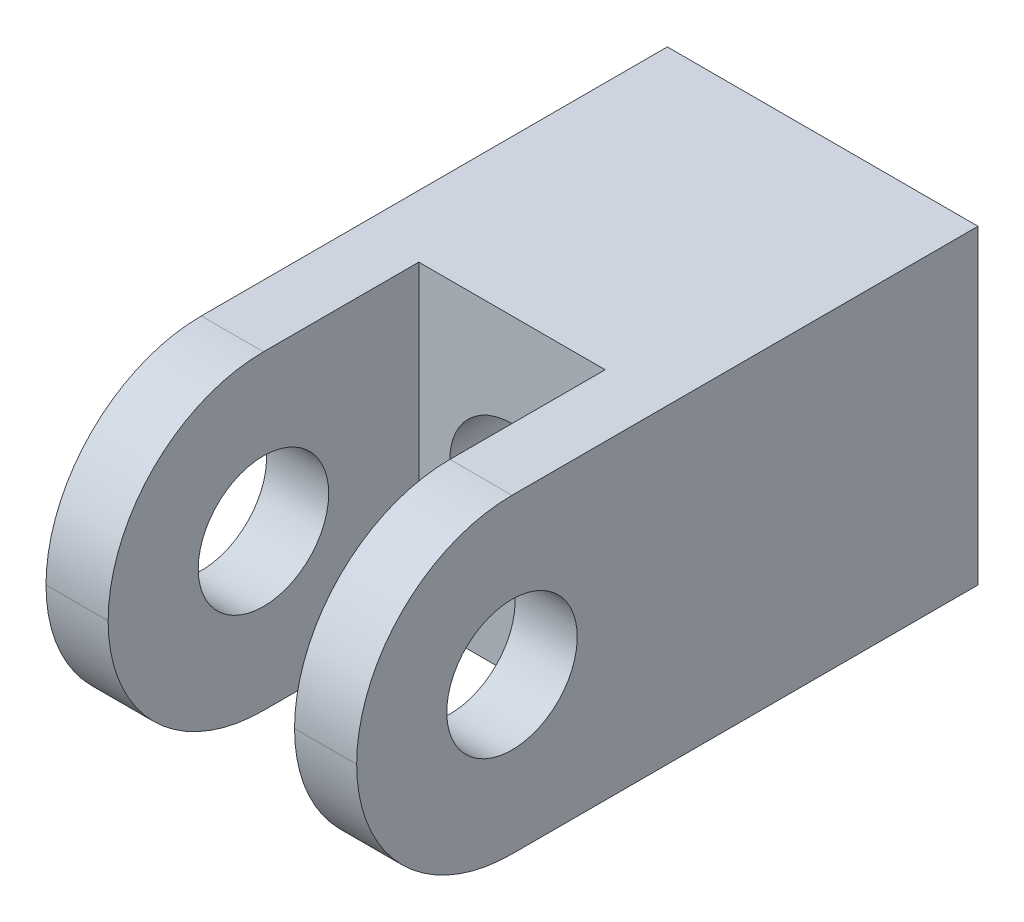
ISO-10303-21;
HEADER;
FILE_DESCRIPTION(('STEP AP214'),'2;1');
FILE_NAME('part.step','',(''),(''),'','','');
FILE_SCHEMA(('AUTOMOTIVE_DESIGN { 1 0 10303 214 1 1 1 1 }'));
ENDSEC;
DATA;
#1=APPLICATION_CONTEXT('core data for automotive mechanical design processes');
#2=APPLICATION_PROTOCOL_DEFINITION('international standard','automotive_design',2000,#1);
#3=PRODUCT_CONTEXT('',#1,'mechanical');
#4=PRODUCT('Part','Part','',(#3));
#5=PRODUCT_RELATED_PRODUCT_CATEGORY('part','',(#4));
#6=PRODUCT_DEFINITION_FORMATION('','',#4);
#7=PRODUCT_DEFINITION_CONTEXT('part definition',#1,'design');
#8=PRODUCT_DEFINITION('design','',#6,#7);
#9=PRODUCT_DEFINITION_SHAPE('','',#8);
#10=(LENGTH_UNIT() NAMED_UNIT(*) SI_UNIT(.MILLI.,.METRE.));
#11=(NAMED_UNIT(*) PLANE_ANGLE_UNIT() SI_UNIT($,.RADIAN.));
#12=(NAMED_UNIT(*) SI_UNIT($,.STERADIAN.) SOLID_ANGLE_UNIT());
#13=UNCERTAINTY_MEASURE_WITH_UNIT(LENGTH_MEASURE(1.E-05),#10,'distance_accuracy_value','');
#14=(GEOMETRIC_REPRESENTATION_CONTEXT(3) GLOBAL_UNCERTAINTY_ASSIGNED_CONTEXT((#13)) GLOBAL_UNIT_ASSIGNED_CONTEXT((#10,
#11,#12)) REPRESENTATION_CONTEXT('',''));
#15=CARTESIAN_POINT('',(0.,0.,0.));
#16=DIRECTION('',(0.,0.,1.));
#17=DIRECTION('',(1.,0.,0.));
#18=AXIS2_PLACEMENT_3D('',#15,#16,#17);
#19=CARTESIAN_POINT('',(0.,0.,10.));
#20=DIRECTION('',(0.,0.,-1.));
#21=DIRECTION('',(-1.,0.,0.));
#22=AXIS2_PLACEMENT_3D('',#19,#20,#21);
#23=PLANE('',#22);
#24=CARTESIAN_POINT('',(0.,0.,10.));
#25=DIRECTION('',(0.,0.,1.));
#26=DIRECTION('',(1.,0.,0.));
#27=AXIS2_PLACEMENT_3D('',#24,#25,#26);
#28=CIRCLE('',#27,2.);
#29=CARTESIAN_POINT('',(2.,0.,10.));
#30=VERTEX_POINT('',#29);
#31=EDGE_CURVE('E145',#30,#30,#28,.T.);
#32=ORIENTED_EDGE('',*,*,#31,.F.);
#33=EDGE_LOOP('',(#32));
#34=FACE_BOUND('',#33,.T.);
#35=DIRECTION('',(0.,-1.,0.));
#36=VECTOR('',#35,1.);
#37=CARTESIAN_POINT('',(3.,5.,10.));
#38=LINE('',#37,#36);
#39=CARTESIAN_POINT('',(3.,5.,10.));
#40=VERTEX_POINT('',#39);
#41=CARTESIAN_POINT('',(3.,-5.,10.));
#42=VERTEX_POINT('',#41);
#43=EDGE_CURVE('E131',#40,#42,#38,.T.);
#44=ORIENTED_EDGE('',*,*,#43,.F.);
#45=DIRECTION('',(-1.,0.,0.));
#46=VECTOR('',#45,1.);
#47=CARTESIAN_POINT('',(-5.,5.,10.));
#48=LINE('',#47,#46);
#49=CARTESIAN_POINT('',(-3.,5.,10.));
#50=VERTEX_POINT('',#49);
#51=EDGE_CURVE('E117',#40,#50,#48,.T.);
#52=ORIENTED_EDGE('',*,*,#51,.T.);
#53=DIRECTION('',(0.,1.,0.));
#54=VECTOR('',#53,1.);
#55=CARTESIAN_POINT('',(-3.,5.,10.));
#56=LINE('',#55,#54);
#57=CARTESIAN_POINT('',(-3.,-5.,10.));
#58=VERTEX_POINT('',#57);
#59=EDGE_CURVE('E123',#58,#50,#56,.T.);
#60=ORIENTED_EDGE('',*,*,#59,.F.);
#61=DIRECTION('',(1.,0.,0.));
#62=VECTOR('',#61,1.);
#63=CARTESIAN_POINT('',(-5.,-5.,10.));
#64=LINE('',#63,#62);
#65=EDGE_CURVE('E132',#58,#42,#64,.T.);
#66=ORIENTED_EDGE('',*,*,#65,.T.);
#67=EDGE_LOOP('',(#44,#52,#60,#66));
#68=FACE_BOUND('',#67,.T.);
#69=ADVANCED_FACE('F35',(#34,#68),#23,.F.);
#70=CARTESIAN_POINT('',(0.,0.,0.));
#71=DIRECTION('',(0.,0.,-1.));
#72=DIRECTION('',(-1.,0.,0.));
#73=AXIS2_PLACEMENT_3D('',#70,#71,#72);
#74=PLANE('',#73);
#75=DIRECTION('',(0.,1.,0.));
#76=VECTOR('',#75,1.);
#77=CARTESIAN_POINT('',(5.,-5.,0.));
#78=LINE('',#77,#76);
#79=CARTESIAN_POINT('',(5.,-5.,0.));
#80=VERTEX_POINT('',#79);
#81=CARTESIAN_POINT('',(5.,5.,0.));
#82=VERTEX_POINT('',#81);
#83=EDGE_CURVE('E148',#80,#82,#78,.T.);
#84=ORIENTED_EDGE('',*,*,#83,.F.);
#85=DIRECTION('',(1.,0.,0.));
#86=VECTOR('',#85,1.);
#87=CARTESIAN_POINT('',(-5.,-5.,0.));
#88=LINE('',#87,#86);
#89=CARTESIAN_POINT('',(-5.,-5.,0.));
#90=VERTEX_POINT('',#89);
#91=EDGE_CURVE('E133',#90,#80,#88,.T.);
#92=ORIENTED_EDGE('',*,*,#91,.F.);
#93=DIRECTION('',(0.,-1.,0.));
#94=VECTOR('',#93,1.);
#95=CARTESIAN_POINT('',(-5.,-5.,0.));
#96=LINE('',#95,#94);
#97=CARTESIAN_POINT('',(-5.,5.,0.));
#98=VERTEX_POINT('',#97);
#99=EDGE_CURVE('E158',#98,#90,#96,.T.);
#100=ORIENTED_EDGE('',*,*,#99,.F.);
#101=DIRECTION('',(-1.,0.,0.));
#102=VECTOR('',#101,1.);
#103=CARTESIAN_POINT('',(-5.,5.,0.));
#104=LINE('',#103,#102);
#105=EDGE_CURVE('E155',#82,#98,#104,.T.);
#106=ORIENTED_EDGE('',*,*,#105,.F.);
#107=EDGE_LOOP('',(#84,#92,#100,#106));
#108=FACE_BOUND('',#107,.T.);
#109=CARTESIAN_POINT('',(0.,0.,0.));
#110=DIRECTION('',(0.,0.,1.));
#111=DIRECTION('',(1.,0.,0.));
#112=AXIS2_PLACEMENT_3D('',#109,#110,#111);
#113=CIRCLE('',#112,2.);
#114=CARTESIAN_POINT('',(2.,0.,0.));
#115=VERTEX_POINT('',#114);
#116=EDGE_CURVE('E144',#115,#115,#113,.T.);
#117=ORIENTED_EDGE('',*,*,#116,.T.);
#118=EDGE_LOOP('',(#117));
#119=FACE_BOUND('',#118,.T.);
#120=ADVANCED_FACE('F243',(#108,#119),#74,.T.);
#121=CARTESIAN_POINT('',(5.,-5.,10.));
#122=DIRECTION('',(-1.,0.,0.));
#123=DIRECTION('',(0.,-1.,0.));
#124=AXIS2_PLACEMENT_3D('',#121,#122,#123);
#125=PLANE('',#124);
#126=CARTESIAN_POINT('',(5.,0.,15.));
#127=DIRECTION('',(1.,0.,0.));
#128=DIRECTION('',(0.,1.,0.));
#129=AXIS2_PLACEMENT_3D('',#126,#127,#128);
#130=CIRCLE('',#129,2.1);
#131=CARTESIAN_POINT('',(5.,2.1,15.));
#132=VERTEX_POINT('',#131);
#133=EDGE_CURVE('E196',#132,#132,#130,.T.);
#134=ORIENTED_EDGE('',*,*,#133,.F.);
#135=EDGE_LOOP('',(#134));
#136=FACE_BOUND('',#135,.T.);
#137=CARTESIAN_POINT('',(5.,0.,15.));
#138=DIRECTION('',(-1.,0.,0.));
#139=DIRECTION('',(0.,-1.,0.));
#140=AXIS2_PLACEMENT_3D('',#137,#138,#139);
#141=CIRCLE('',#140,5.);
#142=CARTESIAN_POINT('',(5.,5.,15.));
#143=VERTEX_POINT('',#142);
#144=CARTESIAN_POINT('',(5.,0.,20.));
#145=VERTEX_POINT('',#144);
#146=EDGE_CURVE('E170',#143,#145,#141,.F.);
#147=ORIENTED_EDGE('',*,*,#146,.T.);
#148=CARTESIAN_POINT('',(5.,0.,15.));
#149=DIRECTION('',(-1.,0.,0.));
#150=DIRECTION('',(0.,-1.,0.));
#151=AXIS2_PLACEMENT_3D('',#148,#149,#150);
#152=CIRCLE('',#151,5.);
#153=CARTESIAN_POINT('',(5.,-5.,15.));
#154=VERTEX_POINT('',#153);
#155=EDGE_CURVE('E177',#145,#154,#152,.F.);
#156=ORIENTED_EDGE('',*,*,#155,.T.);
#157=DIRECTION('',(0.,0.,-1.));
#158=VECTOR('',#157,1.);
#159=CARTESIAN_POINT('',(5.,-5.,10.));
#160=LINE('',#159,#158);
#161=EDGE_CURVE('E152',#154,#80,#160,.T.);
#162=ORIENTED_EDGE('',*,*,#161,.T.);
#163=ORIENTED_EDGE('',*,*,#83,.T.);
#164=DIRECTION('',(0.,0.,-1.));
#165=VECTOR('',#164,1.);
#166=CARTESIAN_POINT('',(5.,5.,10.));
#167=LINE('',#166,#165);
#168=EDGE_CURVE('E168',#143,#82,#167,.T.);
#169=ORIENTED_EDGE('',*,*,#168,.F.);
#170=EDGE_LOOP('',(#147,#156,#162,#163,#169));
#171=FACE_BOUND('',#170,.T.);
#172=ADVANCED_FACE('F249',(#136,#171),#125,.F.);
#173=CARTESIAN_POINT('',(-5.,5.,10.));
#174=DIRECTION('',(0.,-1.,0.));
#175=DIRECTION('',(0.,0.,-1.));
#176=AXIS2_PLACEMENT_3D('',#173,#174,#175);
#177=PLANE('',#176);
#178=DIRECTION('',(0.,0.,-1.));
#179=VECTOR('',#178,1.);
#180=CARTESIAN_POINT('',(3.,5.,20.));
#181=LINE('',#180,#179);
#182=CARTESIAN_POINT('',(3.,5.,15.));
#183=VERTEX_POINT('',#182);
#184=EDGE_CURVE('E139',#183,#40,#181,.T.);
#185=ORIENTED_EDGE('',*,*,#184,.F.);
#186=DIRECTION('',(-1.,0.,0.));
#187=VECTOR('',#186,1.);
#188=CARTESIAN_POINT('',(5.,5.,15.));
#189=LINE('',#188,#187);
#190=EDGE_CURVE('E189',#183,#143,#189,.F.);
#191=ORIENTED_EDGE('',*,*,#190,.T.);
#192=ORIENTED_EDGE('',*,*,#168,.T.);
#193=ORIENTED_EDGE('',*,*,#105,.T.);
#194=DIRECTION('',(0.,0.,-1.));
#195=VECTOR('',#194,1.);
#196=CARTESIAN_POINT('',(-5.,5.,10.));
#197=LINE('',#196,#195);
#198=CARTESIAN_POINT('',(-5.,5.,15.));
#199=VERTEX_POINT('',#198);
#200=EDGE_CURVE('E166',#199,#98,#197,.T.);
#201=ORIENTED_EDGE('',*,*,#200,.F.);
#202=DIRECTION('',(-1.,0.,0.));
#203=VECTOR('',#202,1.);
#204=CARTESIAN_POINT('',(-3.,5.,15.));
#205=LINE('',#204,#203);
#206=CARTESIAN_POINT('',(-3.,5.,15.));
#207=VERTEX_POINT('',#206);
#208=EDGE_CURVE('E120',#199,#207,#205,.F.);
#209=ORIENTED_EDGE('',*,*,#208,.T.);
#210=DIRECTION('',(0.,0.,-1.));
#211=VECTOR('',#210,1.);
#212=CARTESIAN_POINT('',(-3.,5.,20.));
#213=LINE('',#212,#211);
#214=EDGE_CURVE('E113',#207,#50,#213,.T.);
#215=ORIENTED_EDGE('',*,*,#214,.T.);
#216=ORIENTED_EDGE('',*,*,#51,.F.);
#217=EDGE_LOOP('',(#185,#191,#192,#193,#201,#209,#215,#216));
#218=FACE_BOUND('',#217,.T.);
#219=ADVANCED_FACE('F116',(#218),#177,.F.);
#220=CARTESIAN_POINT('',(-5.,-5.,10.));
#221=DIRECTION('',(1.,0.,0.));
#222=DIRECTION('',(0.,0.,-1.));
#223=AXIS2_PLACEMENT_3D('',#220,#221,#222);
#224=PLANE('',#223);
#225=CARTESIAN_POINT('',(-5.,0.,15.));
#226=DIRECTION('',(1.,0.,0.));
#227=DIRECTION('',(0.,1.,0.));
#228=AXIS2_PLACEMENT_3D('',#225,#226,#227);
#229=CIRCLE('',#228,2.1);
#230=CARTESIAN_POINT('',(-5.,2.1,15.));
#231=VERTEX_POINT('',#230);
#232=EDGE_CURVE('E175',#231,#231,#229,.T.);
#233=ORIENTED_EDGE('',*,*,#232,.T.);
#234=EDGE_LOOP('',(#233));
#235=FACE_BOUND('',#234,.T.);
#236=CARTESIAN_POINT('',(-5.,0.,15.));
#237=DIRECTION('',(1.,0.,0.));
#238=DIRECTION('',(0.,0.,-1.));
#239=AXIS2_PLACEMENT_3D('',#236,#237,#238);
#240=CIRCLE('',#239,5.);
#241=CARTESIAN_POINT('',(-5.,-5.,15.));
#242=VERTEX_POINT('',#241);
#243=CARTESIAN_POINT('',(-5.,0.,20.));
#244=VERTEX_POINT('',#243);
#245=EDGE_CURVE('E58',#242,#244,#240,.F.);
#246=ORIENTED_EDGE('',*,*,#245,.T.);
#247=CARTESIAN_POINT('',(-5.,0.,15.));
#248=DIRECTION('',(1.,0.,0.));
#249=DIRECTION('',(0.,0.,-1.));
#250=AXIS2_PLACEMENT_3D('',#247,#248,#249);
#251=CIRCLE('',#250,5.);
#252=EDGE_CURVE('E192',#244,#199,#251,.F.);
#253=ORIENTED_EDGE('',*,*,#252,.T.);
#254=ORIENTED_EDGE('',*,*,#200,.T.);
#255=ORIENTED_EDGE('',*,*,#99,.T.);
#256=DIRECTION('',(0.,0.,-1.));
#257=VECTOR('',#256,1.);
#258=CARTESIAN_POINT('',(-5.,-5.,10.));
#259=LINE('',#258,#257);
#260=EDGE_CURVE('E164',#242,#90,#259,.T.);
#261=ORIENTED_EDGE('',*,*,#260,.F.);
#262=EDGE_LOOP('',(#246,#253,#254,#255,#261));
#263=FACE_BOUND('',#262,.T.);
#264=ADVANCED_FACE('F221',(#235,#263),#224,.F.);
#265=CARTESIAN_POINT('',(-5.,-5.,10.));
#266=DIRECTION('',(0.,1.,0.));
#267=DIRECTION('',(0.,0.,1.));
#268=AXIS2_PLACEMENT_3D('',#265,#266,#267);
#269=PLANE('',#268);
#270=ORIENTED_EDGE('',*,*,#161,.F.);
#271=DIRECTION('',(1.,0.,0.));
#272=VECTOR('',#271,1.);
#273=CARTESIAN_POINT('',(3.,-5.,15.));
#274=LINE('',#273,#272);
#275=CARTESIAN_POINT('',(3.,-5.,15.));
#276=VERTEX_POINT('',#275);
#277=EDGE_CURVE('E181',#154,#276,#274,.F.);
#278=ORIENTED_EDGE('',*,*,#277,.T.);
#279=DIRECTION('',(0.,0.,-1.));
#280=VECTOR('',#279,1.);
#281=CARTESIAN_POINT('',(3.,-5.,20.));
#282=LINE('',#281,#280);
#283=EDGE_CURVE('E137',#276,#42,#282,.T.);
#284=ORIENTED_EDGE('',*,*,#283,.T.);
#285=ORIENTED_EDGE('',*,*,#65,.F.);
#286=DIRECTION('',(0.,0.,-1.));
#287=VECTOR('',#286,1.);
#288=CARTESIAN_POINT('',(-3.,-5.,20.));
#289=LINE('',#288,#287);
#290=CARTESIAN_POINT('',(-3.,-5.,15.));
#291=VERTEX_POINT('',#290);
#292=EDGE_CURVE('E122',#291,#58,#289,.T.);
#293=ORIENTED_EDGE('',*,*,#292,.F.);
#294=DIRECTION('',(1.,0.,0.));
#295=VECTOR('',#294,1.);
#296=CARTESIAN_POINT('',(-5.,-5.,15.));
#297=LINE('',#296,#295);
#298=EDGE_CURVE('E179',#291,#242,#297,.F.);
#299=ORIENTED_EDGE('',*,*,#298,.T.);
#300=ORIENTED_EDGE('',*,*,#260,.T.);
#301=ORIENTED_EDGE('',*,*,#91,.T.);
#302=EDGE_LOOP('',(#270,#278,#284,#285,#293,#299,#300,#301));
#303=FACE_BOUND('',#302,.T.);
#304=ADVANCED_FACE('F210',(#303),#269,.F.);
#305=CARTESIAN_POINT('',(0.,0.,10.));
#306=DIRECTION('',(0.,0.,-1.));
#307=DIRECTION('',(-1.,0.,0.));
#308=AXIS2_PLACEMENT_3D('',#305,#306,#307);
#309=CYLINDRICAL_SURFACE('',#308,2.);
#310=ORIENTED_EDGE('',*,*,#31,.T.);
#311=EDGE_LOOP('',(#310));
#312=FACE_BOUND('',#311,.T.);
#313=ORIENTED_EDGE('',*,*,#116,.F.);
#314=EDGE_LOOP('',(#313));
#315=FACE_BOUND('',#314,.T.);
#316=ADVANCED_FACE('F232',(#312,#315),#309,.F.);
#317=CARTESIAN_POINT('',(-3.,5.,20.));
#318=DIRECTION('',(-1.,0.,0.));
#319=DIRECTION('',(0.,-1.,0.));
#320=AXIS2_PLACEMENT_3D('',#317,#318,#319);
#321=PLANE('',#320);
#322=CARTESIAN_POINT('',(-3.,0.,15.));
#323=DIRECTION('',(-1.,0.,0.));
#324=DIRECTION('',(0.,-1.,0.));
#325=AXIS2_PLACEMENT_3D('',#322,#323,#324);
#326=CIRCLE('',#325,2.1);
#327=CARTESIAN_POINT('',(-3.,-2.1,15.));
#328=VERTEX_POINT('',#327);
#329=EDGE_CURVE('E174',#328,#328,#326,.T.);
#330=ORIENTED_EDGE('',*,*,#329,.T.);
#331=EDGE_LOOP('',(#330));
#332=FACE_BOUND('',#331,.T.);
#333=ORIENTED_EDGE('',*,*,#214,.F.);
#334=CARTESIAN_POINT('',(-3.,0.,15.));
#335=DIRECTION('',(-1.,0.,0.));
#336=DIRECTION('',(0.,-1.,0.));
#337=AXIS2_PLACEMENT_3D('',#334,#335,#336);
#338=CIRCLE('',#337,5.);
#339=CARTESIAN_POINT('',(-3.,0.,20.));
#340=VERTEX_POINT('',#339);
#341=EDGE_CURVE('E11',#207,#340,#338,.F.);
#342=ORIENTED_EDGE('',*,*,#341,.T.);
#343=CARTESIAN_POINT('',(-3.,0.,15.));
#344=DIRECTION('',(-1.,0.,0.));
#345=DIRECTION('',(0.,-1.,0.));
#346=AXIS2_PLACEMENT_3D('',#343,#344,#345);
#347=CIRCLE('',#346,5.);
#348=EDGE_CURVE('E44',#340,#291,#347,.F.);
#349=ORIENTED_EDGE('',*,*,#348,.T.);
#350=ORIENTED_EDGE('',*,*,#292,.T.);
#351=ORIENTED_EDGE('',*,*,#59,.T.);
#352=EDGE_LOOP('',(#333,#342,#349,#350,#351));
#353=FACE_BOUND('',#352,.T.);
#354=ADVANCED_FACE('F135',(#332,#353),#321,.F.);
#355=CARTESIAN_POINT('',(3.,5.,20.));
#356=DIRECTION('',(1.,0.,0.));
#357=DIRECTION('',(0.,1.,0.));
#358=AXIS2_PLACEMENT_3D('',#355,#356,#357);
#359=PLANE('',#358);
#360=CARTESIAN_POINT('',(3.,0.,15.));
#361=DIRECTION('',(1.,0.,0.));
#362=DIRECTION('',(0.,1.,0.));
#363=AXIS2_PLACEMENT_3D('',#360,#361,#362);
#364=CIRCLE('',#363,2.1);
#365=CARTESIAN_POINT('',(3.,2.1,15.));
#366=VERTEX_POINT('',#365);
#367=EDGE_CURVE('E171',#366,#366,#364,.T.);
#368=ORIENTED_EDGE('',*,*,#367,.T.);
#369=EDGE_LOOP('',(#368));
#370=FACE_BOUND('',#369,.T.);
#371=ORIENTED_EDGE('',*,*,#283,.F.);
#372=CARTESIAN_POINT('',(3.,0.,15.));
#373=DIRECTION('',(1.,0.,0.));
#374=DIRECTION('',(0.,1.,0.));
#375=AXIS2_PLACEMENT_3D('',#372,#373,#374);
#376=CIRCLE('',#375,5.);
#377=CARTESIAN_POINT('',(3.,0.,20.));
#378=VERTEX_POINT('',#377);
#379=EDGE_CURVE('E186',#276,#378,#376,.F.);
#380=ORIENTED_EDGE('',*,*,#379,.T.);
#381=CARTESIAN_POINT('',(3.,0.,15.));
#382=DIRECTION('',(1.,0.,0.));
#383=DIRECTION('',(0.,1.,0.));
#384=AXIS2_PLACEMENT_3D('',#381,#382,#383);
#385=CIRCLE('',#384,5.);
#386=EDGE_CURVE('E184',#378,#183,#385,.F.);
#387=ORIENTED_EDGE('',*,*,#386,.T.);
#388=ORIENTED_EDGE('',*,*,#184,.T.);
#389=ORIENTED_EDGE('',*,*,#43,.T.);
#390=EDGE_LOOP('',(#371,#380,#387,#388,#389));
#391=FACE_BOUND('',#390,.T.);
#392=ADVANCED_FACE('F213',(#370,#391),#359,.F.);
#393=CARTESIAN_POINT('',(-5.,0.,15.));
#394=DIRECTION('',(1.,0.,0.));
#395=DIRECTION('',(0.,1.,0.));
#396=AXIS2_PLACEMENT_3D('',#393,#394,#395);
#397=CYLINDRICAL_SURFACE('',#396,2.1);
#398=ORIENTED_EDGE('',*,*,#133,.T.);
#399=EDGE_LOOP('',(#398));
#400=FACE_BOUND('',#399,.T.);
#401=ORIENTED_EDGE('',*,*,#367,.F.);
#402=EDGE_LOOP('',(#401));
#403=FACE_BOUND('',#402,.T.);
#404=ADVANCED_FACE('F227',(#400,#403),#397,.F.);
#405=ORIENTED_EDGE('',*,*,#232,.F.);
#406=EDGE_LOOP('',(#405));
#407=FACE_BOUND('',#406,.T.);
#408=ORIENTED_EDGE('',*,*,#329,.F.);
#409=EDGE_LOOP('',(#408));
#410=FACE_BOUND('',#409,.T.);
#411=ADVANCED_FACE('F223',(#407,#410),#397,.F.);
#412=CARTESIAN_POINT('',(0.,0.,15.));
#413=DIRECTION('',(1.,0.,0.));
#414=DIRECTION('',(0.,0.,-1.));
#415=AXIS2_PLACEMENT_3D('',#412,#413,#414);
#416=CYLINDRICAL_SURFACE('',#415,5.);
#417=ORIENTED_EDGE('',*,*,#190,.F.);
#418=ORIENTED_EDGE('',*,*,#386,.F.);
#419=DIRECTION('',(-1.,0.,0.));
#420=VECTOR('',#419,1.);
#421=CARTESIAN_POINT('',(3.,0.,20.));
#422=LINE('',#421,#420);
#423=EDGE_CURVE('E194',#145,#378,#422,.T.);
#424=ORIENTED_EDGE('',*,*,#423,.F.);
#425=ORIENTED_EDGE('',*,*,#146,.F.);
#426=EDGE_LOOP('',(#417,#418,#424,#425));
#427=FACE_BOUND('',#426,.T.);
#428=ADVANCED_FACE('F226',(#427),#416,.T.);
#429=CARTESIAN_POINT('',(0.,0.,15.));
#430=DIRECTION('',(-1.,0.,0.));
#431=DIRECTION('',(0.,0.,1.));
#432=AXIS2_PLACEMENT_3D('',#429,#430,#431);
#433=CYLINDRICAL_SURFACE('',#432,5.);
#434=ORIENTED_EDGE('',*,*,#379,.F.);
#435=ORIENTED_EDGE('',*,*,#277,.F.);
#436=ORIENTED_EDGE('',*,*,#155,.F.);
#437=ORIENTED_EDGE('',*,*,#423,.T.);
#438=EDGE_LOOP('',(#434,#435,#436,#437));
#439=FACE_BOUND('',#438,.T.);
#440=ADVANCED_FACE('F263',(#439),#433,.T.);
#441=CARTESIAN_POINT('',(0.,0.,15.));
#442=DIRECTION('',(-1.,0.,0.));
#443=DIRECTION('',(0.,0.,1.));
#444=AXIS2_PLACEMENT_3D('',#441,#442,#443);
#445=CYLINDRICAL_SURFACE('',#444,5.);
#446=ORIENTED_EDGE('',*,*,#298,.F.);
#447=ORIENTED_EDGE('',*,*,#348,.F.);
#448=DIRECTION('',(1.,0.,0.));
#449=VECTOR('',#448,1.);
#450=CARTESIAN_POINT('',(-3.,0.,20.));
#451=LINE('',#450,#449);
#452=EDGE_CURVE('E39',#244,#340,#451,.T.);
#453=ORIENTED_EDGE('',*,*,#452,.F.);
#454=ORIENTED_EDGE('',*,*,#245,.F.);
#455=EDGE_LOOP('',(#446,#447,#453,#454));
#456=FACE_BOUND('',#455,.T.);
#457=ADVANCED_FACE('F37',(#456),#445,.T.);
#458=CARTESIAN_POINT('',(0.,0.,15.));
#459=DIRECTION('',(1.,0.,0.));
#460=DIRECTION('',(0.,0.,-1.));
#461=AXIS2_PLACEMENT_3D('',#458,#459,#460);
#462=CYLINDRICAL_SURFACE('',#461,5.);
#463=ORIENTED_EDGE('',*,*,#341,.F.);
#464=ORIENTED_EDGE('',*,*,#208,.F.);
#465=ORIENTED_EDGE('',*,*,#252,.F.);
#466=ORIENTED_EDGE('',*,*,#452,.T.);
#467=EDGE_LOOP('',(#463,#464,#465,#466));
#468=FACE_BOUND('',#467,.T.);
#469=ADVANCED_FACE('F205',(#468),#462,.T.);
#470=CLOSED_SHELL('',(#69,#120,#172,#219,#264,#304,#316,#354,#392,#404,#411,#428,#440,#457,#469));
#471=MANIFOLD_SOLID_BREP('B2',#470);
#472=ADVANCED_BREP_SHAPE_REPRESENTATION('',(#18,#471),#14);
#473=SHAPE_DEFINITION_REPRESENTATION(#9,#472);
ENDSEC;
END-ISO-10303-21;
